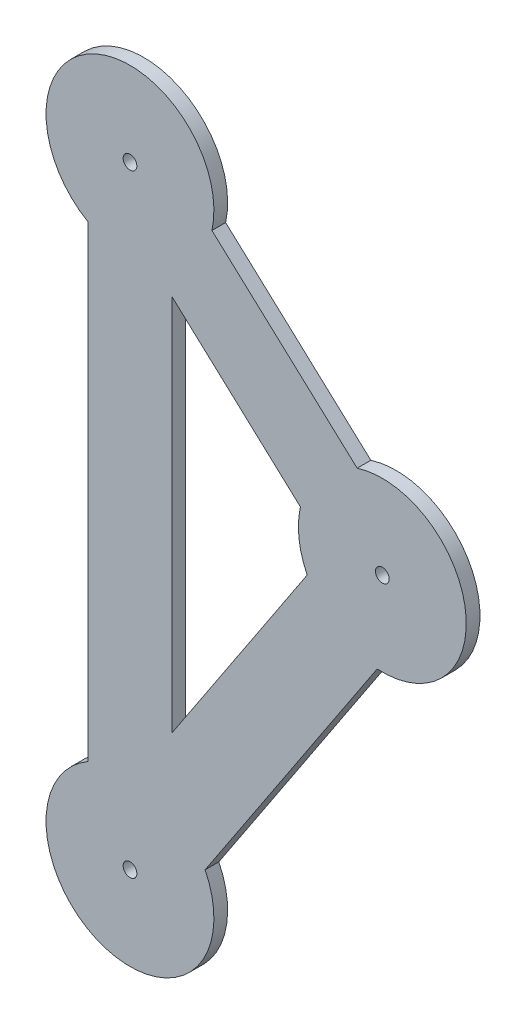
ISO-10303-21;
HEADER;
FILE_DESCRIPTION(('STEP AP214'),'2;1');
FILE_NAME('part.step','',(''),(''),'','','');
FILE_SCHEMA(('AUTOMOTIVE_DESIGN { 1 0 10303 214 1 1 1 1 }'));
ENDSEC;
DATA;
#1=APPLICATION_CONTEXT('core data for automotive mechanical design processes');
#2=APPLICATION_PROTOCOL_DEFINITION('international standard','automotive_design',2000,#1);
#3=PRODUCT_CONTEXT('',#1,'mechanical');
#4=PRODUCT('Part','Part','',(#3));
#5=PRODUCT_RELATED_PRODUCT_CATEGORY('part','',(#4));
#6=PRODUCT_DEFINITION_FORMATION('','',#4);
#7=PRODUCT_DEFINITION_CONTEXT('part definition',#1,'design');
#8=PRODUCT_DEFINITION('design','',#6,#7);
#9=PRODUCT_DEFINITION_SHAPE('','',#8);
#10=(LENGTH_UNIT() NAMED_UNIT(*) SI_UNIT(.MILLI.,.METRE.));
#11=(NAMED_UNIT(*) PLANE_ANGLE_UNIT() SI_UNIT($,.RADIAN.));
#12=(NAMED_UNIT(*) SI_UNIT($,.STERADIAN.) SOLID_ANGLE_UNIT());
#13=UNCERTAINTY_MEASURE_WITH_UNIT(LENGTH_MEASURE(1.E-05),#10,'distance_accuracy_value','');
#14=(GEOMETRIC_REPRESENTATION_CONTEXT(3) GLOBAL_UNCERTAINTY_ASSIGNED_CONTEXT((#13)) GLOBAL_UNIT_ASSIGNED_CONTEXT((#10,
#11,#12)) REPRESENTATION_CONTEXT('',''));
#15=CARTESIAN_POINT('',(0.,0.,0.));
#16=DIRECTION('',(0.,0.,1.));
#17=DIRECTION('',(1.,0.,0.));
#18=AXIS2_PLACEMENT_3D('',#15,#16,#17);
#19=CARTESIAN_POINT('',(38.1,-204.417109913942,6.223));
#20=DIRECTION('',(-1.,0.,0.));
#21=DIRECTION('',(0.,0.,1.));
#22=AXIS2_PLACEMENT_3D('',#19,#20,#21);
#23=PLANE('',#22);
#24=DIRECTION('',(0.,1.,0.));
#25=VECTOR('',#24,1.);
#26=CARTESIAN_POINT('',(38.1,-204.417109913942,0.));
#27=LINE('',#26,#25);
#28=CARTESIAN_POINT('',(38.1,63.2911657169307,0.));
#29=VERTEX_POINT('',#28);
#30=CARTESIAN_POINT('',(38.1,234.799894239948,0.));
#31=VERTEX_POINT('',#30);
#32=EDGE_CURVE('E168',#29,#31,#27,.T.);
#33=ORIENTED_EDGE('',*,*,#32,.T.);
#34=DIRECTION('',(0.,0.,-1.));
#35=VECTOR('',#34,1.);
#36=CARTESIAN_POINT('',(38.1,234.799894239948,6.223));
#37=LINE('',#36,#35);
#38=CARTESIAN_POINT('',(38.1,234.799894239948,6.223));
#39=VERTEX_POINT('',#38);
#40=EDGE_CURVE('E11',#39,#31,#37,.T.);
#41=ORIENTED_EDGE('',*,*,#40,.F.);
#42=DIRECTION('',(0.,1.,0.));
#43=VECTOR('',#42,1.);
#44=CARTESIAN_POINT('',(38.1,-204.417109913942,6.223));
#45=LINE('',#44,#43);
#46=CARTESIAN_POINT('',(38.1,63.2911657169307,6.223));
#47=VERTEX_POINT('',#46);
#48=EDGE_CURVE('E127',#47,#39,#45,.T.);
#49=ORIENTED_EDGE('',*,*,#48,.F.);
#50=DIRECTION('',(0.,0.,-1.));
#51=VECTOR('',#50,1.);
#52=CARTESIAN_POINT('',(38.1,63.2911657169307,6.223));
#53=LINE('',#52,#51);
#54=EDGE_CURVE('E181',#47,#29,#53,.T.);
#55=ORIENTED_EDGE('',*,*,#54,.T.);
#56=EDGE_LOOP('',(#33,#41,#49,#55));
#57=FACE_BOUND('',#56,.T.);
#58=ADVANCED_FACE('F33',(#57),#23,.F.);
#59=CARTESIAN_POINT('',(276.552295980087,16.0320614133162,6.223));
#60=DIRECTION('',(0.67603784283881,0.736866904569508,0.));
#61=DIRECTION('',(-0.736866904569508,0.67603784283881,0.));
#62=AXIS2_PLACEMENT_3D('',#59,#60,#61);
#63=PLANE('',#62);
#64=DIRECTION('',(0.736866904569508,-0.67603784283881,0.));
#65=VECTOR('',#64,1.);
#66=CARTESIAN_POINT('',(276.552295980087,16.0320614133162,0.));
#67=LINE('',#66,#65);
#68=CARTESIAN_POINT('',(96.4026237041076,181.310207410011,0.));
#69=VERTEX_POINT('',#68);
#70=EDGE_CURVE('E132',#31,#69,#67,.T.);
#71=ORIENTED_EDGE('',*,*,#70,.T.);
#72=DIRECTION('',(0.,0.,-1.));
#73=VECTOR('',#72,1.);
#74=CARTESIAN_POINT('',(96.4026237041076,181.310207410011,6.223));
#75=LINE('',#74,#73);
#76=CARTESIAN_POINT('',(96.4026237041076,181.310207410011,6.223));
#77=VERTEX_POINT('',#76);
#78=EDGE_CURVE('E43',#77,#69,#75,.T.);
#79=ORIENTED_EDGE('',*,*,#78,.F.);
#80=DIRECTION('',(0.736866904569508,-0.67603784283881,0.));
#81=VECTOR('',#80,1.);
#82=CARTESIAN_POINT('',(276.552295980087,16.0320614133162,6.223));
#83=LINE('',#82,#81);
#84=EDGE_CURVE('E120',#39,#77,#83,.T.);
#85=ORIENTED_EDGE('',*,*,#84,.F.);
#86=ORIENTED_EDGE('',*,*,#40,.T.);
#87=EDGE_LOOP('',(#71,#79,#85,#86));
#88=FACE_BOUND('',#87,.T.);
#89=ADVANCED_FACE('F131',(#88),#63,.F.);
#90=CARTESIAN_POINT('',(133.594486581521,173.041269406393,6.223));
#91=DIRECTION('',(0.,0.,-1.));
#92=DIRECTION('',(-1.,0.,0.));
#93=AXIS2_PLACEMENT_3D('',#90,#91,#92);
#94=CYLINDRICAL_SURFACE('',#93,38.1);
#95=CARTESIAN_POINT('',(133.594486581521,173.041269406393,0.));
#96=DIRECTION('',(0.,0.,1.));
#97=DIRECTION('',(1.,0.,0.));
#98=AXIS2_PLACEMENT_3D('',#95,#96,#97);
#99=CIRCLE('',#98,38.1);
#100=CARTESIAN_POINT('',(99.4967381213791,156.042635639266,0.));
#101=VERTEX_POINT('',#100);
#102=EDGE_CURVE('E87',#69,#101,#99,.T.);
#103=ORIENTED_EDGE('',*,*,#102,.T.);
#104=DIRECTION('',(0.,0.,-1.));
#105=VECTOR('',#104,1.);
#106=CARTESIAN_POINT('',(99.4967381213791,156.042635639266,6.223));
#107=LINE('',#106,#105);
#108=CARTESIAN_POINT('',(99.4967381213791,156.042635639266,6.223));
#109=VERTEX_POINT('',#108);
#110=EDGE_CURVE('E133',#109,#101,#107,.T.);
#111=ORIENTED_EDGE('',*,*,#110,.F.);
#112=CARTESIAN_POINT('',(133.594486581521,173.041269406393,6.223));
#113=DIRECTION('',(0.,0.,1.));
#114=DIRECTION('',(1.,0.,0.));
#115=AXIS2_PLACEMENT_3D('',#112,#113,#114);
#116=CIRCLE('',#115,38.1);
#117=EDGE_CURVE('E125',#77,#109,#116,.T.);
#118=ORIENTED_EDGE('',*,*,#117,.F.);
#119=ORIENTED_EDGE('',*,*,#78,.T.);
#120=EDGE_LOOP('',(#103,#111,#118,#119));
#121=FACE_BOUND('',#120,.T.);
#122=ADVANCED_FACE('F135',(#121),#94,.T.);
#123=CARTESIAN_POINT('',(0.,-204.417109913942,6.223));
#124=DIRECTION('',(-1.,0.,0.));
#125=DIRECTION('',(0.,0.,1.));
#126=AXIS2_PLACEMENT_3D('',#123,#124,#125);
#127=PLANE('',#126);
#128=DIRECTION('',(0.,1.,0.));
#129=VECTOR('',#128,1.);
#130=CARTESIAN_POINT('',(0.,-204.417109913942,0.));
#131=LINE('',#130,#129);
#132=CARTESIAN_POINT('',(0.,32.9955678841871,0.));
#133=VERTEX_POINT('',#132);
#134=CARTESIAN_POINT('',(0.,245.134432115813,0.));
#135=VERTEX_POINT('',#134);
#136=EDGE_CURVE('E147',#133,#135,#131,.T.);
#137=ORIENTED_EDGE('',*,*,#136,.F.);
#138=DIRECTION('',(0.,0.,-1.));
#139=VECTOR('',#138,1.);
#140=CARTESIAN_POINT('',(0.,32.9955678841871,6.223));
#141=LINE('',#140,#139);
#142=CARTESIAN_POINT('',(0.,32.9955678841871,6.223));
#143=VERTEX_POINT('',#142);
#144=EDGE_CURVE('E37',#143,#133,#141,.T.);
#145=ORIENTED_EDGE('',*,*,#144,.F.);
#146=DIRECTION('',(0.,1.,0.));
#147=VECTOR('',#146,1.);
#148=CARTESIAN_POINT('',(0.,-204.417109913942,6.223));
#149=LINE('',#148,#147);
#150=CARTESIAN_POINT('',(0.,245.134432115813,6.223));
#151=VERTEX_POINT('',#150);
#152=EDGE_CURVE('E180',#143,#151,#149,.T.);
#153=ORIENTED_EDGE('',*,*,#152,.T.);
#154=DIRECTION('',(0.,0.,-1.));
#155=VECTOR('',#154,1.);
#156=CARTESIAN_POINT('',(0.,245.134432115813,6.223));
#157=LINE('',#156,#155);
#158=EDGE_CURVE('E146',#151,#135,#157,.T.);
#159=ORIENTED_EDGE('',*,*,#158,.T.);
#160=EDGE_LOOP('',(#137,#145,#153,#159));
#161=FACE_BOUND('',#160,.T.);
#162=ADVANCED_FACE('F35',(#161),#127,.T.);
#163=CARTESIAN_POINT('',(19.05,0.,6.223));
#164=DIRECTION('',(0.,0.,-1.));
#165=DIRECTION('',(-1.,0.,0.));
#166=AXIS2_PLACEMENT_3D('',#163,#164,#165);
#167=CYLINDRICAL_SURFACE('',#166,38.1);
#168=CARTESIAN_POINT('',(19.05,0.,0.));
#169=DIRECTION('',(0.,0.,1.));
#170=DIRECTION('',(1.,0.,0.));
#171=AXIS2_PLACEMENT_3D('',#168,#169,#170);
#172=CIRCLE('',#171,38.1);
#173=CARTESIAN_POINT('',(53.1477484601418,16.9986337671265,0.));
#174=VERTEX_POINT('',#173);
#175=EDGE_CURVE('E150',#133,#174,#172,.T.);
#176=ORIENTED_EDGE('',*,*,#175,.T.);
#177=DIRECTION('',(0.,0.,-1.));
#178=VECTOR('',#177,1.);
#179=CARTESIAN_POINT('',(53.1477484601418,16.9986337671265,6.223));
#180=LINE('',#179,#178);
#181=CARTESIAN_POINT('',(53.1477484601418,16.9986337671265,6.223));
#182=VERTEX_POINT('',#181);
#183=EDGE_CURVE('E190',#182,#174,#180,.T.);
#184=ORIENTED_EDGE('',*,*,#183,.F.);
#185=CARTESIAN_POINT('',(19.05,0.,6.223));
#186=DIRECTION('',(0.,0.,1.));
#187=DIRECTION('',(1.,0.,0.));
#188=AXIS2_PLACEMENT_3D('',#185,#186,#187);
#189=CIRCLE('',#188,38.1);
#190=EDGE_CURVE('E198',#143,#182,#189,.T.);
#191=ORIENTED_EDGE('',*,*,#190,.F.);
#192=ORIENTED_EDGE('',*,*,#144,.T.);
#193=EDGE_LOOP('',(#176,#184,#191,#192));
#194=FACE_BOUND('',#193,.T.);
#195=ADVANCED_FACE('F197',(#194),#167,.T.);
#196=CARTESIAN_POINT('',(-42.318204887659,-127.220876445947,6.223));
#197=DIRECTION('',(0.833861493491614,-0.551973740020244,0.));
#198=DIRECTION('',(0.551973740020244,0.833861493491614,0.));
#199=AXIS2_PLACEMENT_3D('',#196,#197,#198);
#200=PLANE('',#199);
#201=DIRECTION('',(-0.551973740020244,-0.833861493491614,0.));
#202=VECTOR('',#201,1.);
#203=CARTESIAN_POINT('',(-42.318204887659,-127.220876445947,0.));
#204=LINE('',#203,#202);
#205=CARTESIAN_POINT('',(131.26686102341,135.012436144495,0.));
#206=VERTEX_POINT('',#205);
#207=EDGE_CURVE('E153',#206,#174,#204,.T.);
#208=ORIENTED_EDGE('',*,*,#207,.F.);
#209=DIRECTION('',(0.,0.,-1.));
#210=VECTOR('',#209,1.);
#211=CARTESIAN_POINT('',(131.26686102341,135.012436144495,6.223));
#212=LINE('',#211,#210);
#213=CARTESIAN_POINT('',(131.26686102341,135.012436144495,6.223));
#214=VERTEX_POINT('',#213);
#215=EDGE_CURVE('E189',#214,#206,#212,.T.);
#216=ORIENTED_EDGE('',*,*,#215,.F.);
#217=DIRECTION('',(-0.551973740020244,-0.833861493491614,0.));
#218=VECTOR('',#217,1.);
#219=CARTESIAN_POINT('',(-42.318204887659,-127.220876445947,6.223));
#220=LINE('',#219,#218);
#221=EDGE_CURVE('E221',#214,#182,#220,.T.);
#222=ORIENTED_EDGE('',*,*,#221,.T.);
#223=ORIENTED_EDGE('',*,*,#183,.T.);
#224=EDGE_LOOP('',(#208,#216,#222,#223));
#225=FACE_BOUND('',#224,.T.);
#226=ADVANCED_FACE('F219',(#225),#200,.T.);
#227=CARTESIAN_POINT('',(133.594486581521,173.041269406393,6.223));
#228=DIRECTION('',(0.,0.,-1.));
#229=DIRECTION('',(-1.,0.,0.));
#230=AXIS2_PLACEMENT_3D('',#227,#228,#229);
#231=CYLINDRICAL_SURFACE('',#230,38.1);
#232=CARTESIAN_POINT('',(133.594486581521,173.041269406393,0.));
#233=DIRECTION('',(0.,0.,1.));
#234=DIRECTION('',(1.,0.,0.));
#235=AXIS2_PLACEMENT_3D('',#232,#233,#234);
#236=CIRCLE('',#235,38.1);
#237=CARTESIAN_POINT('',(122.159665516266,209.384836474109,0.));
#238=VERTEX_POINT('',#237);
#239=EDGE_CURVE('E156',#206,#238,#236,.T.);
#240=ORIENTED_EDGE('',*,*,#239,.T.);
#241=DIRECTION('',(0.,0.,-1.));
#242=VECTOR('',#241,1.);
#243=CARTESIAN_POINT('',(122.159665516266,209.384836474109,6.223));
#244=LINE('',#243,#242);
#245=CARTESIAN_POINT('',(122.159665516266,209.384836474109,6.223));
#246=VERTEX_POINT('',#245);
#247=EDGE_CURVE('E187',#246,#238,#244,.T.);
#248=ORIENTED_EDGE('',*,*,#247,.F.);
#249=CARTESIAN_POINT('',(133.594486581521,173.041269406393,6.223));
#250=DIRECTION('',(0.,0.,1.));
#251=DIRECTION('',(1.,0.,0.));
#252=AXIS2_PLACEMENT_3D('',#249,#250,#251);
#253=CIRCLE('',#252,38.1);
#254=EDGE_CURVE('E222',#214,#246,#253,.T.);
#255=ORIENTED_EDGE('',*,*,#254,.F.);
#256=ORIENTED_EDGE('',*,*,#215,.T.);
#257=EDGE_LOOP('',(#240,#248,#255,#256));
#258=FACE_BOUND('',#257,.T.);
#259=ADVANCED_FACE('F218',(#258),#231,.T.);
#260=CARTESIAN_POINT('',(302.309337792246,44.1066904774144,6.223));
#261=DIRECTION('',(0.67603784283881,0.736866904569508,0.));
#262=DIRECTION('',(-0.736866904569508,0.67603784283881,0.));
#263=AXIS2_PLACEMENT_3D('',#260,#261,#262);
#264=PLANE('',#263);
#265=DIRECTION('',(0.736866904569508,-0.67603784283881,0.));
#266=VECTOR('',#265,1.);
#267=CARTESIAN_POINT('',(302.309337792246,44.1066904774144,0.));
#268=LINE('',#267,#266);
#269=CARTESIAN_POINT('',(56.2418628774133,269.861061996382,0.));
#270=VERTEX_POINT('',#269);
#271=EDGE_CURVE('E159',#270,#238,#268,.T.);
#272=ORIENTED_EDGE('',*,*,#271,.F.);
#273=DIRECTION('',(0.,0.,-1.));
#274=VECTOR('',#273,1.);
#275=CARTESIAN_POINT('',(56.2418628774133,269.861061996382,6.223));
#276=LINE('',#275,#274);
#277=CARTESIAN_POINT('',(56.2418628774133,269.861061996382,6.223));
#278=VERTEX_POINT('',#277);
#279=EDGE_CURVE('E185',#278,#270,#276,.T.);
#280=ORIENTED_EDGE('',*,*,#279,.F.);
#281=DIRECTION('',(0.736866904569508,-0.67603784283881,0.));
#282=VECTOR('',#281,1.);
#283=CARTESIAN_POINT('',(302.309337792246,44.1066904774144,6.223));
#284=LINE('',#283,#282);
#285=EDGE_CURVE('E215',#278,#246,#284,.T.);
#286=ORIENTED_EDGE('',*,*,#285,.T.);
#287=ORIENTED_EDGE('',*,*,#247,.T.);
#288=EDGE_LOOP('',(#272,#280,#286,#287));
#289=FACE_BOUND('',#288,.T.);
#290=ADVANCED_FACE('F211',(#289),#264,.T.);
#291=CARTESIAN_POINT('',(19.05,278.13,6.223));
#292=DIRECTION('',(0.,0.,-1.));
#293=DIRECTION('',(-1.,0.,0.));
#294=AXIS2_PLACEMENT_3D('',#291,#292,#293);
#295=CYLINDRICAL_SURFACE('',#294,3.11150000000001);
#296=CARTESIAN_POINT('',(19.05,278.13,6.223));
#297=DIRECTION('',(0.,0.,1.));
#298=DIRECTION('',(1.,0.,0.));
#299=AXIS2_PLACEMENT_3D('',#296,#297,#298);
#300=CIRCLE('',#299,3.11150000000001);
#301=CARTESIAN_POINT('',(22.1615,278.13,6.223));
#302=VERTEX_POINT('',#301);
#303=EDGE_CURVE('E137',#302,#302,#300,.T.);
#304=ORIENTED_EDGE('',*,*,#303,.T.);
#305=EDGE_LOOP('',(#304));
#306=FACE_BOUND('',#305,.T.);
#307=CARTESIAN_POINT('',(19.05,278.13,0.));
#308=DIRECTION('',(0.,0.,1.));
#309=DIRECTION('',(1.,0.,0.));
#310=AXIS2_PLACEMENT_3D('',#307,#308,#309);
#311=CIRCLE('',#310,3.11150000000001);
#312=CARTESIAN_POINT('',(22.1615,278.13,0.));
#313=VERTEX_POINT('',#312);
#314=EDGE_CURVE('E174',#313,#313,#311,.T.);
#315=ORIENTED_EDGE('',*,*,#314,.F.);
#316=EDGE_LOOP('',(#315));
#317=FACE_BOUND('',#316,.T.);
#318=ADVANCED_FACE('F265',(#306,#317),#295,.F.);
#319=CARTESIAN_POINT('',(-74.0883277896895,-106.190676951176,6.223));
#320=DIRECTION('',(0.833861493491614,-0.551973740020244,0.));
#321=DIRECTION('',(0.551973740020244,0.833861493491614,0.));
#322=AXIS2_PLACEMENT_3D('',#319,#320,#321);
#323=PLANE('',#322);
#324=DIRECTION('',(-0.551973740020244,-0.833861493491614,0.));
#325=VECTOR('',#324,1.);
#326=CARTESIAN_POINT('',(-74.0883277896895,-106.190676951176,0.));
#327=LINE('',#326,#325);
#328=EDGE_CURVE('E93',#101,#29,#327,.T.);
#329=ORIENTED_EDGE('',*,*,#328,.T.);
#330=ORIENTED_EDGE('',*,*,#54,.F.);
#331=DIRECTION('',(-0.551973740020244,-0.833861493491614,0.));
#332=VECTOR('',#331,1.);
#333=CARTESIAN_POINT('',(-74.0883277896895,-106.190676951176,6.223));
#334=LINE('',#333,#332);
#335=EDGE_CURVE('E52',#109,#47,#334,.T.);
#336=ORIENTED_EDGE('',*,*,#335,.F.);
#337=ORIENTED_EDGE('',*,*,#110,.T.);
#338=EDGE_LOOP('',(#329,#330,#336,#337));
#339=FACE_BOUND('',#338,.T.);
#340=ADVANCED_FACE('F260',(#339),#323,.F.);
#341=CARTESIAN_POINT('',(19.05,0.,6.223));
#342=DIRECTION('',(0.,0.,-1.));
#343=DIRECTION('',(-1.,0.,0.));
#344=AXIS2_PLACEMENT_3D('',#341,#342,#343);
#345=CYLINDRICAL_SURFACE('',#344,3.1115);
#346=CARTESIAN_POINT('',(19.05,0.,6.223));
#347=DIRECTION('',(0.,0.,1.));
#348=DIRECTION('',(1.,0.,0.));
#349=AXIS2_PLACEMENT_3D('',#346,#347,#348);
#350=CIRCLE('',#349,3.1115);
#351=CARTESIAN_POINT('',(22.1615,0.,6.223));
#352=VERTEX_POINT('',#351);
#353=EDGE_CURVE('E233',#352,#352,#350,.T.);
#354=ORIENTED_EDGE('',*,*,#353,.T.);
#355=EDGE_LOOP('',(#354));
#356=FACE_BOUND('',#355,.T.);
#357=CARTESIAN_POINT('',(19.05,0.,0.));
#358=DIRECTION('',(0.,0.,1.));
#359=DIRECTION('',(1.,0.,0.));
#360=AXIS2_PLACEMENT_3D('',#357,#358,#359);
#361=CIRCLE('',#360,3.1115);
#362=CARTESIAN_POINT('',(22.1615,0.,0.));
#363=VERTEX_POINT('',#362);
#364=EDGE_CURVE('E165',#363,#363,#361,.T.);
#365=ORIENTED_EDGE('',*,*,#364,.F.);
#366=EDGE_LOOP('',(#365));
#367=FACE_BOUND('',#366,.T.);
#368=ADVANCED_FACE('F237',(#356,#367),#345,.F.);
#369=CARTESIAN_POINT('',(19.05,278.13,6.223));
#370=DIRECTION('',(0.,0.,-1.));
#371=DIRECTION('',(-1.,0.,0.));
#372=AXIS2_PLACEMENT_3D('',#369,#370,#371);
#373=CYLINDRICAL_SURFACE('',#372,38.1);
#374=CARTESIAN_POINT('',(19.05,278.13,0.));
#375=DIRECTION('',(0.,0.,1.));
#376=DIRECTION('',(1.,0.,0.));
#377=AXIS2_PLACEMENT_3D('',#374,#375,#376);
#378=CIRCLE('',#377,38.1);
#379=EDGE_CURVE('E162',#270,#135,#378,.T.);
#380=ORIENTED_EDGE('',*,*,#379,.T.);
#381=ORIENTED_EDGE('',*,*,#158,.F.);
#382=CARTESIAN_POINT('',(19.05,278.13,6.223));
#383=DIRECTION('',(0.,0.,1.));
#384=DIRECTION('',(1.,0.,0.));
#385=AXIS2_PLACEMENT_3D('',#382,#383,#384);
#386=CIRCLE('',#385,38.1);
#387=EDGE_CURVE('E231',#278,#151,#386,.T.);
#388=ORIENTED_EDGE('',*,*,#387,.F.);
#389=ORIENTED_EDGE('',*,*,#279,.T.);
#390=EDGE_LOOP('',(#380,#381,#388,#389));
#391=FACE_BOUND('',#390,.T.);
#392=ADVANCED_FACE('F208',(#391),#373,.T.);
#393=CARTESIAN_POINT('',(133.594486581521,173.041269406393,6.223));
#394=DIRECTION('',(0.,0.,-1.));
#395=DIRECTION('',(-1.,0.,0.));
#396=AXIS2_PLACEMENT_3D('',#393,#394,#395);
#397=CYLINDRICAL_SURFACE('',#396,3.11149999999999);
#398=CARTESIAN_POINT('',(133.594486581521,173.041269406393,6.223));
#399=DIRECTION('',(0.,0.,1.));
#400=DIRECTION('',(1.,0.,0.));
#401=AXIS2_PLACEMENT_3D('',#398,#399,#400);
#402=CIRCLE('',#401,3.11149999999999);
#403=CARTESIAN_POINT('',(136.705986581521,173.041269406393,6.223));
#404=VERTEX_POINT('',#403);
#405=EDGE_CURVE('E143',#404,#404,#402,.T.);
#406=ORIENTED_EDGE('',*,*,#405,.T.);
#407=EDGE_LOOP('',(#406));
#408=FACE_BOUND('',#407,.T.);
#409=CARTESIAN_POINT('',(133.594486581521,173.041269406393,0.));
#410=DIRECTION('',(0.,0.,1.));
#411=DIRECTION('',(1.,0.,0.));
#412=AXIS2_PLACEMENT_3D('',#409,#410,#411);
#413=CIRCLE('',#412,3.11149999999999);
#414=CARTESIAN_POINT('',(136.705986581521,173.041269406393,0.));
#415=VERTEX_POINT('',#414);
#416=EDGE_CURVE('E177',#415,#415,#413,.T.);
#417=ORIENTED_EDGE('',*,*,#416,.F.);
#418=EDGE_LOOP('',(#417));
#419=FACE_BOUND('',#418,.T.);
#420=ADVANCED_FACE('F240',(#408,#419),#397,.F.);
#421=CARTESIAN_POINT('',(74.3014127941335,-204.417109913942,6.223));
#422=DIRECTION('',(0.,0.,1.));
#423=DIRECTION('',(1.,0.,0.));
#424=AXIS2_PLACEMENT_3D('',#421,#422,#423);
#425=PLANE('',#424);
#426=ORIENTED_EDGE('',*,*,#152,.F.);
#427=ORIENTED_EDGE('',*,*,#190,.T.);
#428=ORIENTED_EDGE('',*,*,#221,.F.);
#429=ORIENTED_EDGE('',*,*,#254,.T.);
#430=ORIENTED_EDGE('',*,*,#285,.F.);
#431=ORIENTED_EDGE('',*,*,#387,.T.);
#432=EDGE_LOOP('',(#426,#427,#428,#429,#430,#431));
#433=FACE_BOUND('',#432,.T.);
#434=ORIENTED_EDGE('',*,*,#353,.F.);
#435=EDGE_LOOP('',(#434));
#436=FACE_BOUND('',#435,.T.);
#437=ORIENTED_EDGE('',*,*,#48,.T.);
#438=ORIENTED_EDGE('',*,*,#84,.T.);
#439=ORIENTED_EDGE('',*,*,#117,.T.);
#440=ORIENTED_EDGE('',*,*,#335,.T.);
#441=EDGE_LOOP('',(#437,#438,#439,#440));
#442=FACE_BOUND('',#441,.T.);
#443=ORIENTED_EDGE('',*,*,#303,.F.);
#444=EDGE_LOOP('',(#443));
#445=FACE_BOUND('',#444,.T.);
#446=ORIENTED_EDGE('',*,*,#405,.F.);
#447=EDGE_LOOP('',(#446));
#448=FACE_BOUND('',#447,.T.);
#449=ADVANCED_FACE('F122',(#433,#436,#442,#445,#448),#425,.T.);
#450=CARTESIAN_POINT('',(74.3014127941335,-204.417109913942,0.));
#451=DIRECTION('',(0.,0.,1.));
#452=DIRECTION('',(1.,0.,0.));
#453=AXIS2_PLACEMENT_3D('',#450,#451,#452);
#454=PLANE('',#453);
#455=ORIENTED_EDGE('',*,*,#136,.T.);
#456=ORIENTED_EDGE('',*,*,#379,.F.);
#457=ORIENTED_EDGE('',*,*,#271,.T.);
#458=ORIENTED_EDGE('',*,*,#239,.F.);
#459=ORIENTED_EDGE('',*,*,#207,.T.);
#460=ORIENTED_EDGE('',*,*,#175,.F.);
#461=EDGE_LOOP('',(#455,#456,#457,#458,#459,#460));
#462=FACE_BOUND('',#461,.T.);
#463=ORIENTED_EDGE('',*,*,#364,.T.);
#464=EDGE_LOOP('',(#463));
#465=FACE_BOUND('',#464,.T.);
#466=ORIENTED_EDGE('',*,*,#32,.F.);
#467=ORIENTED_EDGE('',*,*,#328,.F.);
#468=ORIENTED_EDGE('',*,*,#102,.F.);
#469=ORIENTED_EDGE('',*,*,#70,.F.);
#470=EDGE_LOOP('',(#466,#467,#468,#469));
#471=FACE_BOUND('',#470,.T.);
#472=ORIENTED_EDGE('',*,*,#314,.T.);
#473=EDGE_LOOP('',(#472));
#474=FACE_BOUND('',#473,.T.);
#475=ORIENTED_EDGE('',*,*,#416,.T.);
#476=EDGE_LOOP('',(#475));
#477=FACE_BOUND('',#476,.T.);
#478=ADVANCED_FACE('F201',(#462,#465,#471,#474,#477),#454,.F.);
#479=CLOSED_SHELL('',(#58,#89,#122,#162,#195,#226,#259,#290,#318,#340,#368,#392,#420,#449,#478));
#480=MANIFOLD_SOLID_BREP('B2',#479);
#481=ADVANCED_BREP_SHAPE_REPRESENTATION('',(#18,#480),#14);
#482=SHAPE_DEFINITION_REPRESENTATION(#9,#481);
ENDSEC;
END-ISO-10303-21;
